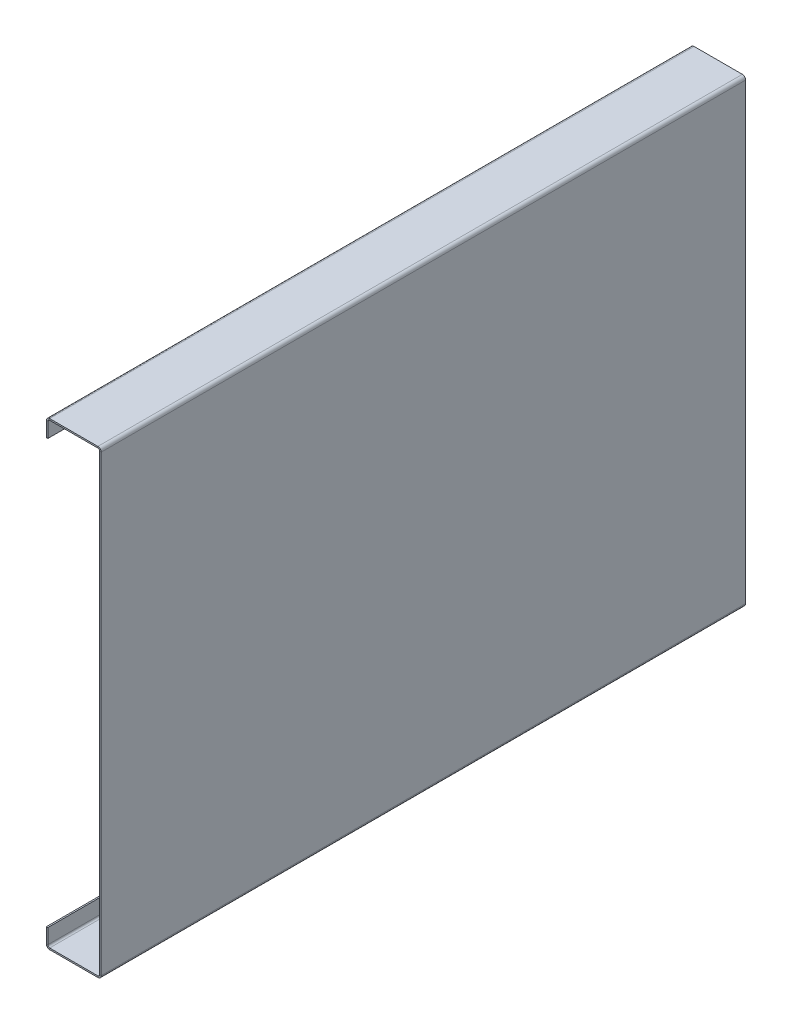
ISO-10303-21;
HEADER;
FILE_DESCRIPTION(('STEP AP214'),'2;1');
FILE_NAME('part.step','',(''),(''),'','','');
FILE_SCHEMA(('AUTOMOTIVE_DESIGN { 1 0 10303 214 1 1 1 1 }'));
ENDSEC;
DATA;
#1=APPLICATION_CONTEXT('core data for automotive mechanical design processes');
#2=APPLICATION_PROTOCOL_DEFINITION('international standard','automotive_design',2000,#1);
#3=PRODUCT_CONTEXT('',#1,'mechanical');
#4=PRODUCT('Part','Part','',(#3));
#5=PRODUCT_RELATED_PRODUCT_CATEGORY('part','',(#4));
#6=PRODUCT_DEFINITION_FORMATION('','',#4);
#7=PRODUCT_DEFINITION_CONTEXT('part definition',#1,'design');
#8=PRODUCT_DEFINITION('design','',#6,#7);
#9=PRODUCT_DEFINITION_SHAPE('','',#8);
#10=(LENGTH_UNIT() NAMED_UNIT(*) SI_UNIT(.MILLI.,.METRE.));
#11=(NAMED_UNIT(*) PLANE_ANGLE_UNIT() SI_UNIT($,.RADIAN.));
#12=(NAMED_UNIT(*) SI_UNIT($,.STERADIAN.) SOLID_ANGLE_UNIT());
#13=UNCERTAINTY_MEASURE_WITH_UNIT(LENGTH_MEASURE(1.E-05),#10,'distance_accuracy_value','');
#14=(GEOMETRIC_REPRESENTATION_CONTEXT(3) GLOBAL_UNCERTAINTY_ASSIGNED_CONTEXT((#13)) GLOBAL_UNIT_ASSIGNED_CONTEXT((#10,
#11,#12)) REPRESENTATION_CONTEXT('',''));
#15=CARTESIAN_POINT('',(0.,0.,0.));
#16=DIRECTION('',(0.,0.,1.));
#17=DIRECTION('',(1.,0.,0.));
#18=AXIS2_PLACEMENT_3D('',#15,#16,#17);
#19=CARTESIAN_POINT('',(-123.499557428757,124.900442571244,0.));
#20=DIRECTION('',(1.,0.,0.));
#21=DIRECTION('',(0.,0.,-1.));
#22=AXIS2_PLACEMENT_3D('',#19,#20,#21);
#23=PLANE('',#22);
#24=DIRECTION('',(0.,-1.,0.));
#25=VECTOR('',#24,1.);
#26=CARTESIAN_POINT('',(-123.499557428757,286.700442571244,-175.));
#27=LINE('',#26,#25);
#28=CARTESIAN_POINT('',(-123.499557428757,248.000885142487,-175.));
#29=VERTEX_POINT('',#28);
#30=CARTESIAN_POINT('',(-123.499557428757,1.79999999999995,-175.));
#31=VERTEX_POINT('',#30);
#32=EDGE_CURVE('E377',#29,#31,#27,.T.);
#33=ORIENTED_EDGE('',*,*,#32,.F.);
#34=DIRECTION('',(0.,0.,1.));
#35=VECTOR('',#34,1.);
#36=CARTESIAN_POINT('',(-123.499557428757,248.000885142487,0.));
#37=LINE('',#36,#35);
#38=CARTESIAN_POINT('',(-123.499557428757,248.000885142487,175.));
#39=VERTEX_POINT('',#38);
#40=EDGE_CURVE('E370',#29,#39,#37,.T.);
#41=ORIENTED_EDGE('',*,*,#40,.T.);
#42=DIRECTION('',(0.,1.,0.));
#43=VECTOR('',#42,1.);
#44=CARTESIAN_POINT('',(-123.499557428757,286.700442571244,175.));
#45=LINE('',#44,#43);
#46=CARTESIAN_POINT('',(-123.499557428756,1.79999999999987,175.));
#47=VERTEX_POINT('',#46);
#48=EDGE_CURVE('E276',#47,#39,#45,.T.);
#49=ORIENTED_EDGE('',*,*,#48,.F.);
#50=DIRECTION('',(0.,0.,1.));
#51=VECTOR('',#50,1.);
#52=CARTESIAN_POINT('',(-123.499557428756,1.79999999999989,0.));
#53=LINE('',#52,#51);
#54=EDGE_CURVE('E359',#31,#47,#53,.T.);
#55=ORIENTED_EDGE('',*,*,#54,.F.);
#56=EDGE_LOOP('',(#33,#41,#49,#55));
#57=FACE_BOUND('',#56,.T.);
#58=ADVANCED_FACE('F56',(#57),#23,.T.);
#59=CARTESIAN_POINT('',(-124.299557428757,286.700442571244,175.));
#60=DIRECTION('',(0.,0.,-1.));
#61=DIRECTION('',(0.,-1.,0.));
#62=AXIS2_PLACEMENT_3D('',#59,#60,#61);
#63=PLANE('',#62);
#64=DIRECTION('',(1.,0.,0.));
#65=VECTOR('',#64,1.);
#66=CARTESIAN_POINT('',(-124.299557428757,248.000885142487,175.));
#67=LINE('',#66,#65);
#68=CARTESIAN_POINT('',(-124.299557428757,248.000885142487,175.));
#69=VERTEX_POINT('',#68);
#70=EDGE_CURVE('E367',#69,#39,#67,.T.);
#71=ORIENTED_EDGE('',*,*,#70,.F.);
#72=DIRECTION('',(0.,1.,0.));
#73=VECTOR('',#72,1.);
#74=CARTESIAN_POINT('',(-124.299557428757,286.700442571244,175.));
#75=LINE('',#74,#73);
#76=CARTESIAN_POINT('',(-124.299557428757,1.8,175.));
#77=VERTEX_POINT('',#76);
#78=EDGE_CURVE('E380',#77,#69,#75,.T.);
#79=ORIENTED_EDGE('',*,*,#78,.F.);
#80=DIRECTION('',(1.,0.,0.));
#81=VECTOR('',#80,1.);
#82=CARTESIAN_POINT('',(-124.299557428756,1.79999999999993,175.));
#83=LINE('',#82,#81);
#84=EDGE_CURVE('E361',#77,#47,#83,.T.);
#85=ORIENTED_EDGE('',*,*,#84,.T.);
#86=ORIENTED_EDGE('',*,*,#48,.T.);
#87=EDGE_LOOP('',(#71,#79,#85,#86));
#88=FACE_BOUND('',#87,.T.);
#89=ADVANCED_FACE('F443',(#88),#63,.F.);
#90=CARTESIAN_POINT('',(-124.299557428757,286.700442571244,-175.));
#91=DIRECTION('',(0.,0.,1.));
#92=DIRECTION('',(0.,1.,0.));
#93=AXIS2_PLACEMENT_3D('',#90,#91,#92);
#94=PLANE('',#93);
#95=DIRECTION('',(-1.,0.,0.));
#96=VECTOR('',#95,1.);
#97=CARTESIAN_POINT('',(-124.299557428757,248.000885142487,-175.));
#98=LINE('',#97,#96);
#99=CARTESIAN_POINT('',(-124.299557428757,248.000885142487,-175.));
#100=VERTEX_POINT('',#99);
#101=EDGE_CURVE('E373',#29,#100,#98,.T.);
#102=ORIENTED_EDGE('',*,*,#101,.F.);
#103=ORIENTED_EDGE('',*,*,#32,.T.);
#104=DIRECTION('',(-1.,0.,0.));
#105=VECTOR('',#104,1.);
#106=CARTESIAN_POINT('',(-124.299557428756,1.7999999999999,-175.));
#107=LINE('',#106,#105);
#108=CARTESIAN_POINT('',(-124.299557428757,1.8,-175.));
#109=VERTEX_POINT('',#108);
#110=EDGE_CURVE('E355',#31,#109,#107,.T.);
#111=ORIENTED_EDGE('',*,*,#110,.T.);
#112=DIRECTION('',(0.,-1.,0.));
#113=VECTOR('',#112,1.);
#114=CARTESIAN_POINT('',(-124.299557428757,286.700442571244,-175.));
#115=LINE('',#114,#113);
#116=EDGE_CURVE('E356',#100,#109,#115,.T.);
#117=ORIENTED_EDGE('',*,*,#116,.F.);
#118=EDGE_LOOP('',(#102,#103,#111,#117));
#119=FACE_BOUND('',#118,.T.);
#120=ADVANCED_FACE('F455',(#119),#94,.F.);
#121=CARTESIAN_POINT('',(-124.299557428757,124.900442571244,0.));
#122=DIRECTION('',(1.,0.,0.));
#123=DIRECTION('',(0.,0.,-1.));
#124=AXIS2_PLACEMENT_3D('',#121,#122,#123);
#125=PLANE('',#124);
#126=DIRECTION('',(0.,0.,1.));
#127=VECTOR('',#126,1.);
#128=CARTESIAN_POINT('',(-124.299557428757,248.000885142487,0.));
#129=LINE('',#128,#127);
#130=EDGE_CURVE('E364',#100,#69,#129,.T.);
#131=ORIENTED_EDGE('',*,*,#130,.F.);
#132=ORIENTED_EDGE('',*,*,#116,.T.);
#133=DIRECTION('',(0.,0.,1.));
#134=VECTOR('',#133,1.);
#135=CARTESIAN_POINT('',(-124.299557428756,1.79999999999989,0.));
#136=LINE('',#135,#134);
#137=EDGE_CURVE('E352',#109,#77,#136,.T.);
#138=ORIENTED_EDGE('',*,*,#137,.T.);
#139=ORIENTED_EDGE('',*,*,#78,.T.);
#140=EDGE_LOOP('',(#131,#132,#138,#139));
#141=FACE_BOUND('',#140,.T.);
#142=ADVANCED_FACE('F450',(#141),#125,.F.);
#143=CARTESIAN_POINT('',(-152.500442571244,9.90044257124353,-175.));
#144=DIRECTION('',(0.,-1.,0.));
#145=DIRECTION('',(0.,0.,-1.));
#146=AXIS2_PLACEMENT_3D('',#143,#144,#145);
#147=PLANE('',#146);
#148=DIRECTION('',(0.,0.,1.));
#149=VECTOR('',#148,1.);
#150=CARTESIAN_POINT('',(-153.300442571244,9.90044257124353,-175.));
#151=LINE('',#150,#149);
#152=CARTESIAN_POINT('',(-153.300442571244,9.90044257124353,-175.));
#153=VERTEX_POINT('',#152);
#154=CARTESIAN_POINT('',(-153.300442571244,9.90044257124353,175.));
#155=VERTEX_POINT('',#154);
#156=EDGE_CURVE('E341',#153,#155,#151,.T.);
#157=ORIENTED_EDGE('',*,*,#156,.T.);
#158=DIRECTION('',(-1.,0.,0.));
#159=VECTOR('',#158,1.);
#160=CARTESIAN_POINT('',(-152.500442571244,9.90044257124353,175.));
#161=LINE('',#160,#159);
#162=CARTESIAN_POINT('',(-152.500442571244,9.90044257124353,175.));
#163=VERTEX_POINT('',#162);
#164=EDGE_CURVE('E335',#163,#155,#161,.T.);
#165=ORIENTED_EDGE('',*,*,#164,.F.);
#166=DIRECTION('',(0.,0.,1.));
#167=VECTOR('',#166,1.);
#168=CARTESIAN_POINT('',(-152.500442571244,9.90044257124353,-175.));
#169=LINE('',#168,#167);
#170=CARTESIAN_POINT('',(-152.500442571244,9.90044257124353,-175.));
#171=VERTEX_POINT('',#170);
#172=EDGE_CURVE('E323',#171,#163,#169,.T.);
#173=ORIENTED_EDGE('',*,*,#172,.F.);
#174=DIRECTION('',(-1.,0.,0.));
#175=VECTOR('',#174,1.);
#176=CARTESIAN_POINT('',(-152.500442571244,9.90044257124353,-175.));
#177=LINE('',#176,#175);
#178=EDGE_CURVE('E338',#171,#153,#177,.T.);
#179=ORIENTED_EDGE('',*,*,#178,.T.);
#180=EDGE_LOOP('',(#157,#165,#173,#179));
#181=FACE_BOUND('',#180,.T.);
#182=ADVANCED_FACE('F513',(#181),#147,.F.);
#183=CARTESIAN_POINT('',(-152.500442571245,-313.699557428756,175.));
#184=DIRECTION('',(0.,0.,-1.));
#185=DIRECTION('',(0.,1.,0.));
#186=AXIS2_PLACEMENT_3D('',#183,#184,#185);
#187=PLANE('',#186);
#188=DIRECTION('',(-1.,0.,0.));
#189=VECTOR('',#188,1.);
#190=CARTESIAN_POINT('',(-152.500442571244,1.79999999999994,175.));
#191=LINE('',#190,#189);
#192=CARTESIAN_POINT('',(-152.500442571244,1.79999999999999,175.));
#193=VERTEX_POINT('',#192);
#194=CARTESIAN_POINT('',(-153.300442571244,1.79999999999994,175.));
#195=VERTEX_POINT('',#194);
#196=EDGE_CURVE('E317',#193,#195,#191,.T.);
#197=ORIENTED_EDGE('',*,*,#196,.F.);
#198=DIRECTION('',(0.,-1.,0.));
#199=VECTOR('',#198,1.);
#200=CARTESIAN_POINT('',(-152.500442571245,-313.699557428756,175.));
#201=LINE('',#200,#199);
#202=EDGE_CURVE('E320',#163,#193,#201,.T.);
#203=ORIENTED_EDGE('',*,*,#202,.F.);
#204=ORIENTED_EDGE('',*,*,#164,.T.);
#205=DIRECTION('',(0.,-1.,0.));
#206=VECTOR('',#205,1.);
#207=CARTESIAN_POINT('',(-153.300442571245,-313.699557428756,175.));
#208=LINE('',#207,#206);
#209=EDGE_CURVE('E333',#155,#195,#208,.T.);
#210=ORIENTED_EDGE('',*,*,#209,.T.);
#211=EDGE_LOOP('',(#197,#203,#204,#210));
#212=FACE_BOUND('',#211,.T.);
#213=ADVANCED_FACE('F494',(#212),#187,.F.);
#214=CARTESIAN_POINT('',(-153.300442571244,-151.899557428756,0.));
#215=DIRECTION('',(-1.,0.,0.));
#216=DIRECTION('',(0.,0.,-1.));
#217=AXIS2_PLACEMENT_3D('',#214,#215,#216);
#218=PLANE('',#217);
#219=DIRECTION('',(0.,1.,0.));
#220=VECTOR('',#219,1.);
#221=CARTESIAN_POINT('',(-153.300442571245,-313.699557428757,-175.));
#222=LINE('',#221,#220);
#223=CARTESIAN_POINT('',(-153.300442571244,1.79999999999983,-175.));
#224=VERTEX_POINT('',#223);
#225=EDGE_CURVE('E328',#224,#153,#222,.T.);
#226=ORIENTED_EDGE('',*,*,#225,.F.);
#227=DIRECTION('',(0.,0.,1.));
#228=VECTOR('',#227,1.);
#229=CARTESIAN_POINT('',(-153.300442571244,1.79999999999997,0.));
#230=LINE('',#229,#228);
#231=EDGE_CURVE('E330',#224,#195,#230,.T.);
#232=ORIENTED_EDGE('',*,*,#231,.T.);
#233=ORIENTED_EDGE('',*,*,#209,.F.);
#234=ORIENTED_EDGE('',*,*,#156,.F.);
#235=EDGE_LOOP('',(#226,#232,#233,#234));
#236=FACE_BOUND('',#235,.T.);
#237=ADVANCED_FACE('F510',(#236),#218,.T.);
#238=CARTESIAN_POINT('',(-152.500442571245,-313.699557428757,-175.));
#239=DIRECTION('',(0.,0.,1.));
#240=DIRECTION('',(0.,-1.,0.));
#241=AXIS2_PLACEMENT_3D('',#238,#239,#240);
#242=PLANE('',#241);
#243=DIRECTION('',(1.,0.,0.));
#244=VECTOR('',#243,1.);
#245=CARTESIAN_POINT('',(-152.500442571244,1.79999999999994,-175.));
#246=LINE('',#245,#244);
#247=CARTESIAN_POINT('',(-152.500442571244,1.79999999999983,-175.));
#248=VERTEX_POINT('',#247);
#249=EDGE_CURVE('E306',#224,#248,#246,.T.);
#250=ORIENTED_EDGE('',*,*,#249,.F.);
#251=ORIENTED_EDGE('',*,*,#225,.T.);
#252=ORIENTED_EDGE('',*,*,#178,.F.);
#253=DIRECTION('',(0.,1.,0.));
#254=VECTOR('',#253,1.);
#255=CARTESIAN_POINT('',(-152.500442571245,-313.699557428757,-175.));
#256=LINE('',#255,#254);
#257=EDGE_CURVE('E326',#248,#171,#256,.T.);
#258=ORIENTED_EDGE('',*,*,#257,.F.);
#259=EDGE_LOOP('',(#250,#251,#252,#258));
#260=FACE_BOUND('',#259,.T.);
#261=ADVANCED_FACE('F507',(#260),#242,.F.);
#262=CARTESIAN_POINT('',(-152.500442571244,-151.899557428756,0.));
#263=DIRECTION('',(-1.,0.,0.));
#264=DIRECTION('',(0.,0.,-1.));
#265=AXIS2_PLACEMENT_3D('',#262,#263,#264);
#266=PLANE('',#265);
#267=DIRECTION('',(0.,0.,1.));
#268=VECTOR('',#267,1.);
#269=CARTESIAN_POINT('',(-152.500442571244,1.79999999999997,0.));
#270=LINE('',#269,#268);
#271=EDGE_CURVE('E297',#248,#193,#270,.T.);
#272=ORIENTED_EDGE('',*,*,#271,.F.);
#273=ORIENTED_EDGE('',*,*,#257,.T.);
#274=ORIENTED_EDGE('',*,*,#172,.T.);
#275=ORIENTED_EDGE('',*,*,#202,.T.);
#276=EDGE_LOOP('',(#272,#273,#274,#275));
#277=FACE_BOUND('',#276,.T.);
#278=ADVANCED_FACE('F496',(#277),#266,.F.);
#279=CARTESIAN_POINT('',(-151.500442571244,1.8,175.));
#280=DIRECTION('',(0.,0.,-1.));
#281=DIRECTION('',(-1.,0.,0.));
#282=AXIS2_PLACEMENT_3D('',#279,#280,#281);
#283=PLANE('',#282);
#284=ORIENTED_EDGE('',*,*,#196,.T.);
#285=CARTESIAN_POINT('',(-151.500442571244,1.8,175.));
#286=DIRECTION('',(0.,0.,1.));
#287=DIRECTION('',(1.,0.,0.));
#288=AXIS2_PLACEMENT_3D('',#285,#286,#287);
#289=CIRCLE('',#288,1.8);
#290=CARTESIAN_POINT('',(-151.500442571244,0.,175.));
#291=VERTEX_POINT('',#290);
#292=EDGE_CURVE('E314',#195,#291,#289,.T.);
#293=ORIENTED_EDGE('',*,*,#292,.T.);
#294=DIRECTION('',(0.,-1.,0.));
#295=VECTOR('',#294,1.);
#296=CARTESIAN_POINT('',(-151.500442571244,0.8,175.));
#297=LINE('',#296,#295);
#298=CARTESIAN_POINT('',(-151.500442571244,0.799999999999999,175.));
#299=VERTEX_POINT('',#298);
#300=EDGE_CURVE('E277',#299,#291,#297,.T.);
#301=ORIENTED_EDGE('',*,*,#300,.F.);
#302=CARTESIAN_POINT('',(-151.500442571244,1.8,175.));
#303=DIRECTION('',(0.,0.,1.));
#304=DIRECTION('',(1.,0.,0.));
#305=AXIS2_PLACEMENT_3D('',#302,#303,#304);
#306=CIRCLE('',#305,1.);
#307=EDGE_CURVE('E303',#193,#299,#306,.T.);
#308=ORIENTED_EDGE('',*,*,#307,.F.);
#309=EDGE_LOOP('',(#284,#293,#301,#308));
#310=FACE_BOUND('',#309,.T.);
#311=ADVANCED_FACE('F491',(#310),#283,.F.);
#312=CARTESIAN_POINT('',(-151.500442571244,1.8,-350.007822921369));
#313=DIRECTION('',(0.,0.,1.));
#314=DIRECTION('',(1.,0.,0.));
#315=AXIS2_PLACEMENT_3D('',#312,#313,#314);
#316=CYLINDRICAL_SURFACE('',#315,1.8);
#317=ORIENTED_EDGE('',*,*,#292,.F.);
#318=ORIENTED_EDGE('',*,*,#231,.F.);
#319=CARTESIAN_POINT('',(-151.500442571244,1.8,-175.));
#320=DIRECTION('',(0.,0.,1.));
#321=DIRECTION('',(1.,0.,0.));
#322=AXIS2_PLACEMENT_3D('',#319,#320,#321);
#323=CIRCLE('',#322,1.8);
#324=CARTESIAN_POINT('',(-151.500442571244,0.,-175.));
#325=VERTEX_POINT('',#324);
#326=EDGE_CURVE('E309',#325,#224,#323,.F.);
#327=ORIENTED_EDGE('',*,*,#326,.F.);
#328=DIRECTION('',(0.,0.,1.));
#329=VECTOR('',#328,1.);
#330=CARTESIAN_POINT('',(-151.500442571244,0.,0.));
#331=LINE('',#330,#329);
#332=EDGE_CURVE('E312',#325,#291,#331,.T.);
#333=ORIENTED_EDGE('',*,*,#332,.T.);
#334=EDGE_LOOP('',(#317,#318,#327,#333));
#335=FACE_BOUND('',#334,.T.);
#336=ADVANCED_FACE('F488',(#335),#316,.T.);
#337=CARTESIAN_POINT('',(-151.500442571244,1.8,-175.));
#338=DIRECTION('',(0.,0.,1.));
#339=DIRECTION('',(1.,0.,0.));
#340=AXIS2_PLACEMENT_3D('',#337,#338,#339);
#341=PLANE('',#340);
#342=DIRECTION('',(0.,1.,0.));
#343=VECTOR('',#342,1.);
#344=CARTESIAN_POINT('',(-151.500442571244,0.8,-175.));
#345=LINE('',#344,#343);
#346=CARTESIAN_POINT('',(-151.500442571244,0.799999999999999,-175.));
#347=VERTEX_POINT('',#346);
#348=EDGE_CURVE('E283',#325,#347,#345,.T.);
#349=ORIENTED_EDGE('',*,*,#348,.F.);
#350=ORIENTED_EDGE('',*,*,#326,.T.);
#351=ORIENTED_EDGE('',*,*,#249,.T.);
#352=CARTESIAN_POINT('',(-151.500442571244,1.8,-175.));
#353=DIRECTION('',(0.,0.,-1.));
#354=DIRECTION('',(-1.,0.,0.));
#355=AXIS2_PLACEMENT_3D('',#352,#353,#354);
#356=CIRCLE('',#355,1.);
#357=EDGE_CURVE('E300',#347,#248,#356,.T.);
#358=ORIENTED_EDGE('',*,*,#357,.F.);
#359=EDGE_LOOP('',(#349,#350,#351,#358));
#360=FACE_BOUND('',#359,.T.);
#361=ADVANCED_FACE('F504',(#360),#341,.F.);
#362=CARTESIAN_POINT('',(-151.500442571244,1.8,-350.007822921369));
#363=DIRECTION('',(0.,0.,1.));
#364=DIRECTION('',(1.,0.,0.));
#365=AXIS2_PLACEMENT_3D('',#362,#363,#364);
#366=CYLINDRICAL_SURFACE('',#365,1.);
#367=ORIENTED_EDGE('',*,*,#307,.T.);
#368=DIRECTION('',(0.,0.,1.));
#369=VECTOR('',#368,1.);
#370=CARTESIAN_POINT('',(-151.500442571244,0.8,0.));
#371=LINE('',#370,#369);
#372=EDGE_CURVE('E291',#347,#299,#371,.T.);
#373=ORIENTED_EDGE('',*,*,#372,.F.);
#374=ORIENTED_EDGE('',*,*,#357,.T.);
#375=ORIENTED_EDGE('',*,*,#271,.T.);
#376=EDGE_LOOP('',(#367,#373,#374,#375));
#377=FACE_BOUND('',#376,.T.);
#378=ADVANCED_FACE('F501',(#377),#366,.F.);
#379=CARTESIAN_POINT('',(0.,0.8,0.));
#380=DIRECTION('',(0.,-1.,0.));
#381=DIRECTION('',(0.,0.,-1.));
#382=AXIS2_PLACEMENT_3D('',#379,#380,#381);
#383=PLANE('',#382);
#384=DIRECTION('',(0.,0.,1.));
#385=VECTOR('',#384,1.);
#386=CARTESIAN_POINT('',(-125.299557428757,0.8,0.));
#387=LINE('',#386,#385);
#388=CARTESIAN_POINT('',(-125.299557428756,0.799999999999999,-175.));
#389=VERTEX_POINT('',#388);
#390=CARTESIAN_POINT('',(-125.299557428756,0.8,175.));
#391=VERTEX_POINT('',#390);
#392=EDGE_CURVE('E269',#389,#391,#387,.T.);
#393=ORIENTED_EDGE('',*,*,#392,.F.);
#394=DIRECTION('',(-1.,0.,0.));
#395=VECTOR('',#394,1.);
#396=CARTESIAN_POINT('',(161.8,0.8,-175.));
#397=LINE('',#396,#395);
#398=EDGE_CURVE('E294',#389,#347,#397,.T.);
#399=ORIENTED_EDGE('',*,*,#398,.T.);
#400=ORIENTED_EDGE('',*,*,#372,.T.);
#401=DIRECTION('',(1.,0.,0.));
#402=VECTOR('',#401,1.);
#403=CARTESIAN_POINT('',(161.8,0.8,175.));
#404=LINE('',#403,#402);
#405=EDGE_CURVE('E289',#299,#391,#404,.T.);
#406=ORIENTED_EDGE('',*,*,#405,.T.);
#407=EDGE_LOOP('',(#393,#399,#400,#406));
#408=FACE_BOUND('',#407,.T.);
#409=ADVANCED_FACE('F476',(#408),#383,.F.);
#410=CARTESIAN_POINT('',(161.8,0.8,-175.));
#411=DIRECTION('',(0.,0.,1.));
#412=DIRECTION('',(1.,0.,0.));
#413=AXIS2_PLACEMENT_3D('',#410,#411,#412);
#414=PLANE('',#413);
#415=DIRECTION('',(0.,1.,0.));
#416=VECTOR('',#415,1.);
#417=CARTESIAN_POINT('',(-125.299557428756,0.8,-175.));
#418=LINE('',#417,#416);
#419=CARTESIAN_POINT('',(-125.299557428756,0.,-175.));
#420=VERTEX_POINT('',#419);
#421=EDGE_CURVE('E344',#420,#389,#418,.T.);
#422=ORIENTED_EDGE('',*,*,#421,.F.);
#423=DIRECTION('',(-1.,0.,0.));
#424=VECTOR('',#423,1.);
#425=CARTESIAN_POINT('',(161.8,0.,-175.));
#426=LINE('',#425,#424);
#427=EDGE_CURVE('E286',#420,#325,#426,.T.);
#428=ORIENTED_EDGE('',*,*,#427,.T.);
#429=ORIENTED_EDGE('',*,*,#348,.T.);
#430=ORIENTED_EDGE('',*,*,#398,.F.);
#431=EDGE_LOOP('',(#422,#428,#429,#430));
#432=FACE_BOUND('',#431,.T.);
#433=ADVANCED_FACE('F481',(#432),#414,.F.);
#434=CARTESIAN_POINT('',(0.,0.,0.));
#435=DIRECTION('',(0.,-1.,0.));
#436=DIRECTION('',(0.,0.,-1.));
#437=AXIS2_PLACEMENT_3D('',#434,#435,#436);
#438=PLANE('',#437);
#439=ORIENTED_EDGE('',*,*,#427,.F.);
#440=DIRECTION('',(0.,0.,1.));
#441=VECTOR('',#440,1.);
#442=CARTESIAN_POINT('',(-125.299557428757,0.,0.));
#443=LINE('',#442,#441);
#444=CARTESIAN_POINT('',(-125.299557428756,0.,175.));
#445=VERTEX_POINT('',#444);
#446=EDGE_CURVE('E280',#420,#445,#443,.T.);
#447=ORIENTED_EDGE('',*,*,#446,.T.);
#448=DIRECTION('',(1.,0.,0.));
#449=VECTOR('',#448,1.);
#450=CARTESIAN_POINT('',(161.8,0.,175.));
#451=LINE('',#450,#449);
#452=EDGE_CURVE('E274',#291,#445,#451,.T.);
#453=ORIENTED_EDGE('',*,*,#452,.F.);
#454=ORIENTED_EDGE('',*,*,#332,.F.);
#455=EDGE_LOOP('',(#439,#447,#453,#454));
#456=FACE_BOUND('',#455,.T.);
#457=ADVANCED_FACE('F484',(#456),#438,.T.);
#458=CARTESIAN_POINT('',(161.8,0.8,175.));
#459=DIRECTION('',(0.,0.,-1.));
#460=DIRECTION('',(-1.,0.,0.));
#461=AXIS2_PLACEMENT_3D('',#458,#459,#460);
#462=PLANE('',#461);
#463=DIRECTION('',(0.,-1.,0.));
#464=VECTOR('',#463,1.);
#465=CARTESIAN_POINT('',(-125.299557428756,0.8,175.));
#466=LINE('',#465,#464);
#467=EDGE_CURVE('E347',#391,#445,#466,.T.);
#468=ORIENTED_EDGE('',*,*,#467,.F.);
#469=ORIENTED_EDGE('',*,*,#405,.F.);
#470=ORIENTED_EDGE('',*,*,#300,.T.);
#471=ORIENTED_EDGE('',*,*,#452,.T.);
#472=EDGE_LOOP('',(#468,#469,#470,#471));
#473=FACE_BOUND('',#472,.T.);
#474=ADVANCED_FACE('F469',(#473),#462,.F.);
#475=CARTESIAN_POINT('',(-125.299557428757,1.8,-175.));
#476=DIRECTION('',(0.,0.,1.));
#477=DIRECTION('',(1.,0.,0.));
#478=AXIS2_PLACEMENT_3D('',#475,#476,#477);
#479=PLANE('',#478);
#480=ORIENTED_EDGE('',*,*,#110,.F.);
#481=CARTESIAN_POINT('',(-125.299557428757,1.8,-175.));
#482=DIRECTION('',(0.,0.,-1.));
#483=DIRECTION('',(-1.,0.,0.));
#484=AXIS2_PLACEMENT_3D('',#481,#482,#483);
#485=CIRCLE('',#484,1.8);
#486=EDGE_CURVE('E257',#31,#420,#485,.T.);
#487=ORIENTED_EDGE('',*,*,#486,.T.);
#488=ORIENTED_EDGE('',*,*,#421,.T.);
#489=CARTESIAN_POINT('',(-125.299557428757,1.8,-175.));
#490=DIRECTION('',(0.,0.,-1.));
#491=DIRECTION('',(-1.,0.,0.));
#492=AXIS2_PLACEMENT_3D('',#489,#490,#491);
#493=CIRCLE('',#492,1.);
#494=EDGE_CURVE('E262',#109,#389,#493,.T.);
#495=ORIENTED_EDGE('',*,*,#494,.F.);
#496=EDGE_LOOP('',(#480,#487,#488,#495));
#497=FACE_BOUND('',#496,.T.);
#498=ADVANCED_FACE('F479',(#497),#479,.F.);
#499=CARTESIAN_POINT('',(-125.299557428756,1.8,175.));
#500=DIRECTION('',(0.,0.,-1.));
#501=DIRECTION('',(-1.,0.,0.));
#502=AXIS2_PLACEMENT_3D('',#499,#500,#501);
#503=PLANE('',#502);
#504=ORIENTED_EDGE('',*,*,#467,.T.);
#505=CARTESIAN_POINT('',(-125.299557428757,1.8,175.));
#506=DIRECTION('',(0.,0.,-1.));
#507=DIRECTION('',(-1.,0.,0.));
#508=AXIS2_PLACEMENT_3D('',#505,#506,#507);
#509=CIRCLE('',#508,1.8);
#510=EDGE_CURVE('E266',#445,#47,#509,.F.);
#511=ORIENTED_EDGE('',*,*,#510,.T.);
#512=ORIENTED_EDGE('',*,*,#84,.F.);
#513=CARTESIAN_POINT('',(-125.299557428756,1.8,175.));
#514=DIRECTION('',(0.,0.,1.));
#515=DIRECTION('',(1.,0.,0.));
#516=AXIS2_PLACEMENT_3D('',#513,#514,#515);
#517=CIRCLE('',#516,0.999999999999987);
#518=EDGE_CURVE('E265',#391,#77,#517,.T.);
#519=ORIENTED_EDGE('',*,*,#518,.F.);
#520=EDGE_LOOP('',(#504,#511,#512,#519));
#521=FACE_BOUND('',#520,.T.);
#522=ADVANCED_FACE('F464',(#521),#503,.F.);
#523=CARTESIAN_POINT('',(-125.299557428756,1.8,350.007822921369));
#524=DIRECTION('',(0.,0.,-1.));
#525=DIRECTION('',(-1.,0.,0.));
#526=AXIS2_PLACEMENT_3D('',#523,#524,#525);
#527=CYLINDRICAL_SURFACE('',#526,1.);
#528=ORIENTED_EDGE('',*,*,#518,.T.);
#529=ORIENTED_EDGE('',*,*,#137,.F.);
#530=ORIENTED_EDGE('',*,*,#494,.T.);
#531=ORIENTED_EDGE('',*,*,#392,.T.);
#532=EDGE_LOOP('',(#528,#529,#530,#531));
#533=FACE_BOUND('',#532,.T.);
#534=ADVANCED_FACE('F473',(#533),#527,.F.);
#535=CARTESIAN_POINT('',(-125.299557428756,1.8,350.007822921369));
#536=DIRECTION('',(0.,0.,-1.));
#537=DIRECTION('',(-1.,0.,0.));
#538=AXIS2_PLACEMENT_3D('',#535,#536,#537);
#539=CYLINDRICAL_SURFACE('',#538,1.8);
#540=ORIENTED_EDGE('',*,*,#510,.F.);
#541=ORIENTED_EDGE('',*,*,#446,.F.);
#542=ORIENTED_EDGE('',*,*,#486,.F.);
#543=ORIENTED_EDGE('',*,*,#54,.T.);
#544=EDGE_LOOP('',(#540,#541,#542,#543));
#545=FACE_BOUND('',#544,.T.);
#546=ADVANCED_FACE('F461',(#545),#539,.T.);
#547=CARTESIAN_POINT('',(-125.299557428757,248.000885142487,175.));
#548=DIRECTION('',(0.,0.,-1.));
#549=DIRECTION('',(-1.,0.,0.));
#550=AXIS2_PLACEMENT_3D('',#547,#548,#549);
#551=PLANE('',#550);
#552=ORIENTED_EDGE('',*,*,#70,.T.);
#553=CARTESIAN_POINT('',(-125.299557428757,248.000885142487,175.));
#554=DIRECTION('',(0.,0.,-1.));
#555=DIRECTION('',(0.,1.,0.));
#556=AXIS2_PLACEMENT_3D('',#553,#554,#555);
#557=CIRCLE('',#556,1.8);
#558=CARTESIAN_POINT('',(-125.299557428757,249.800885142487,175.));
#559=VERTEX_POINT('',#558);
#560=EDGE_CURVE('E241',#39,#559,#557,.F.);
#561=ORIENTED_EDGE('',*,*,#560,.T.);
#562=DIRECTION('',(0.,1.,0.));
#563=VECTOR('',#562,1.);
#564=CARTESIAN_POINT('',(-125.299557428757,249.000885142487,175.));
#565=LINE('',#564,#563);
#566=CARTESIAN_POINT('',(-125.299557428757,249.000885142487,175.));
#567=VERTEX_POINT('',#566);
#568=EDGE_CURVE('E242',#567,#559,#565,.T.);
#569=ORIENTED_EDGE('',*,*,#568,.F.);
#570=CARTESIAN_POINT('',(-125.299557428757,248.000885142487,175.));
#571=DIRECTION('',(0.,0.,-1.));
#572=DIRECTION('',(0.,1.,0.));
#573=AXIS2_PLACEMENT_3D('',#570,#571,#572);
#574=CIRCLE('',#573,1.);
#575=EDGE_CURVE('E250',#69,#567,#574,.F.);
#576=ORIENTED_EDGE('',*,*,#575,.F.);
#577=EDGE_LOOP('',(#552,#561,#569,#576));
#578=FACE_BOUND('',#577,.T.);
#579=ADVANCED_FACE('F439',(#578),#551,.F.);
#580=CARTESIAN_POINT('',(-125.299557428757,248.000885142487,-175.));
#581=DIRECTION('',(0.,0.,1.));
#582=DIRECTION('',(1.,0.,0.));
#583=AXIS2_PLACEMENT_3D('',#580,#581,#582);
#584=PLANE('',#583);
#585=CARTESIAN_POINT('',(-125.299557428757,248.000885142487,-175.));
#586=DIRECTION('',(0.,0.,-1.));
#587=DIRECTION('',(0.,1.,0.));
#588=AXIS2_PLACEMENT_3D('',#585,#586,#587);
#589=CIRCLE('',#588,1.8);
#590=CARTESIAN_POINT('',(-125.299557428757,249.800885142487,-175.));
#591=VERTEX_POINT('',#590);
#592=EDGE_CURVE('E254',#591,#29,#589,.T.);
#593=ORIENTED_EDGE('',*,*,#592,.T.);
#594=ORIENTED_EDGE('',*,*,#101,.T.);
#595=CARTESIAN_POINT('',(-125.299557428757,248.000885142487,-175.));
#596=DIRECTION('',(0.,0.,-1.));
#597=DIRECTION('',(0.,1.,0.));
#598=AXIS2_PLACEMENT_3D('',#595,#596,#597);
#599=CIRCLE('',#598,1.);
#600=CARTESIAN_POINT('',(-125.299557428757,249.000885142487,-175.));
#601=VERTEX_POINT('',#600);
#602=EDGE_CURVE('E253',#601,#100,#599,.T.);
#603=ORIENTED_EDGE('',*,*,#602,.F.);
#604=DIRECTION('',(0.,-1.,0.));
#605=VECTOR('',#604,1.);
#606=CARTESIAN_POINT('',(-125.299557428757,249.000885142487,-175.));
#607=LINE('',#606,#605);
#608=EDGE_CURVE('E238',#591,#601,#607,.T.);
#609=ORIENTED_EDGE('',*,*,#608,.F.);
#610=EDGE_LOOP('',(#593,#594,#603,#609));
#611=FACE_BOUND('',#610,.T.);
#612=ADVANCED_FACE('F453',(#611),#584,.F.);
#613=CARTESIAN_POINT('',(-125.299557428757,248.000885142487,350.007822921369));
#614=DIRECTION('',(0.,0.,-1.));
#615=DIRECTION('',(0.,1.,0.));
#616=AXIS2_PLACEMENT_3D('',#613,#614,#615);
#617=CYLINDRICAL_SURFACE('',#616,1.);
#618=DIRECTION('',(0.,0.,1.));
#619=VECTOR('',#618,1.);
#620=CARTESIAN_POINT('',(-125.299557428757,249.000885142487,0.));
#621=LINE('',#620,#619);
#622=EDGE_CURVE('E245',#601,#567,#621,.T.);
#623=ORIENTED_EDGE('',*,*,#622,.F.);
#624=ORIENTED_EDGE('',*,*,#602,.T.);
#625=ORIENTED_EDGE('',*,*,#130,.T.);
#626=ORIENTED_EDGE('',*,*,#575,.T.);
#627=EDGE_LOOP('',(#623,#624,#625,#626));
#628=FACE_BOUND('',#627,.T.);
#629=ADVANCED_FACE('F447',(#628),#617,.F.);
#630=CARTESIAN_POINT('',(-125.299557428757,248.000885142487,350.007822921369));
#631=DIRECTION('',(0.,0.,-1.));
#632=DIRECTION('',(0.,1.,0.));
#633=AXIS2_PLACEMENT_3D('',#630,#631,#632);
#634=CYLINDRICAL_SURFACE('',#633,1.8);
#635=DIRECTION('',(0.,0.,1.));
#636=VECTOR('',#635,1.);
#637=CARTESIAN_POINT('',(-125.299557428757,249.800885142487,0.));
#638=LINE('',#637,#636);
#639=EDGE_CURVE('E231',#591,#559,#638,.T.);
#640=ORIENTED_EDGE('',*,*,#639,.T.);
#641=ORIENTED_EDGE('',*,*,#560,.F.);
#642=ORIENTED_EDGE('',*,*,#40,.F.);
#643=ORIENTED_EDGE('',*,*,#592,.F.);
#644=EDGE_LOOP('',(#640,#641,#642,#643));
#645=FACE_BOUND('',#644,.T.);
#646=ADVANCED_FACE('F437',(#645),#634,.T.);
#647=CARTESIAN_POINT('',(-7.63278329429795E-13,249.000885142488,0.));
#648=DIRECTION('',(0.,1.,0.));
#649=DIRECTION('',(0.,0.,-1.));
#650=AXIS2_PLACEMENT_3D('',#647,#648,#649);
#651=PLANE('',#650);
#652=DIRECTION('',(0.,0.,1.));
#653=VECTOR('',#652,1.);
#654=CARTESIAN_POINT('',(-151.500442571244,249.000885142487,0.));
#655=LINE('',#654,#653);
#656=CARTESIAN_POINT('',(-151.500442571244,249.000885142487,-175.));
#657=VERTEX_POINT('',#656);
#658=CARTESIAN_POINT('',(-151.500442571244,249.000885142487,175.));
#659=VERTEX_POINT('',#658);
#660=EDGE_CURVE('E376',#657,#659,#655,.T.);
#661=ORIENTED_EDGE('',*,*,#660,.F.);
#662=DIRECTION('',(1.,0.,0.));
#663=VECTOR('',#662,1.);
#664=CARTESIAN_POINT('',(-161.800000000001,249.000885142487,-175.));
#665=LINE('',#664,#663);
#666=EDGE_CURVE('E60',#657,#601,#665,.T.);
#667=ORIENTED_EDGE('',*,*,#666,.T.);
#668=ORIENTED_EDGE('',*,*,#622,.T.);
#669=DIRECTION('',(-1.,0.,0.));
#670=VECTOR('',#669,1.);
#671=CARTESIAN_POINT('',(-161.800000000001,249.000885142487,175.));
#672=LINE('',#671,#670);
#673=EDGE_CURVE('E244',#567,#659,#672,.T.);
#674=ORIENTED_EDGE('',*,*,#673,.T.);
#675=EDGE_LOOP('',(#661,#667,#668,#674));
#676=FACE_BOUND('',#675,.T.);
#677=ADVANCED_FACE('F394',(#676),#651,.F.);
#678=CARTESIAN_POINT('',(-161.800000000001,249.000885142487,175.));
#679=DIRECTION('',(0.,0.,-1.));
#680=DIRECTION('',(1.,0.,0.));
#681=AXIS2_PLACEMENT_3D('',#678,#679,#680);
#682=PLANE('',#681);
#683=DIRECTION('',(0.,1.,0.));
#684=VECTOR('',#683,1.);
#685=CARTESIAN_POINT('',(-151.500442571244,249.000885142487,175.));
#686=LINE('',#685,#684);
#687=CARTESIAN_POINT('',(-151.500442571244,249.800885142487,175.));
#688=VERTEX_POINT('',#687);
#689=EDGE_CURVE('E387',#659,#688,#686,.T.);
#690=ORIENTED_EDGE('',*,*,#689,.F.);
#691=ORIENTED_EDGE('',*,*,#673,.F.);
#692=ORIENTED_EDGE('',*,*,#568,.T.);
#693=DIRECTION('',(-1.,0.,0.));
#694=VECTOR('',#693,1.);
#695=CARTESIAN_POINT('',(-161.800000000001,249.800885142487,175.));
#696=LINE('',#695,#694);
#697=EDGE_CURVE('E81',#559,#688,#696,.T.);
#698=ORIENTED_EDGE('',*,*,#697,.T.);
#699=EDGE_LOOP('',(#690,#691,#692,#698));
#700=FACE_BOUND('',#699,.T.);
#701=ADVANCED_FACE('F397',(#700),#682,.F.);
#702=CARTESIAN_POINT('',(-7.63278329429795E-13,249.800885142488,0.));
#703=DIRECTION('',(0.,1.,0.));
#704=DIRECTION('',(0.,0.,-1.));
#705=AXIS2_PLACEMENT_3D('',#702,#703,#704);
#706=PLANE('',#705);
#707=DIRECTION('',(1.,0.,0.));
#708=VECTOR('',#707,1.);
#709=CARTESIAN_POINT('',(-161.800000000001,249.800885142487,-175.));
#710=LINE('',#709,#708);
#711=CARTESIAN_POINT('',(-151.500442571244,249.800885142487,-175.));
#712=VERTEX_POINT('',#711);
#713=EDGE_CURVE('E73',#712,#591,#710,.T.);
#714=ORIENTED_EDGE('',*,*,#713,.F.);
#715=DIRECTION('',(0.,0.,1.));
#716=VECTOR('',#715,1.);
#717=CARTESIAN_POINT('',(-151.500442571244,249.800885142487,0.));
#718=LINE('',#717,#716);
#719=EDGE_CURVE('E65',#712,#688,#718,.T.);
#720=ORIENTED_EDGE('',*,*,#719,.T.);
#721=ORIENTED_EDGE('',*,*,#697,.F.);
#722=ORIENTED_EDGE('',*,*,#639,.F.);
#723=EDGE_LOOP('',(#714,#720,#721,#722));
#724=FACE_BOUND('',#723,.T.);
#725=ADVANCED_FACE('F430',(#724),#706,.T.);
#726=CARTESIAN_POINT('',(-161.800000000001,249.000885142487,-175.));
#727=DIRECTION('',(0.,0.,1.));
#728=DIRECTION('',(-1.,0.,0.));
#729=AXIS2_PLACEMENT_3D('',#726,#727,#728);
#730=PLANE('',#729);
#731=DIRECTION('',(0.,-1.,0.));
#732=VECTOR('',#731,1.);
#733=CARTESIAN_POINT('',(-151.500442571244,249.000885142487,-175.));
#734=LINE('',#733,#732);
#735=EDGE_CURVE('E12',#712,#657,#734,.T.);
#736=ORIENTED_EDGE('',*,*,#735,.F.);
#737=ORIENTED_EDGE('',*,*,#713,.T.);
#738=ORIENTED_EDGE('',*,*,#608,.T.);
#739=ORIENTED_EDGE('',*,*,#666,.F.);
#740=EDGE_LOOP('',(#736,#737,#738,#739));
#741=FACE_BOUND('',#740,.T.);
#742=ADVANCED_FACE('F58',(#741),#730,.F.);
#743=CARTESIAN_POINT('',(-151.500442571244,248.000885142487,175.));
#744=DIRECTION('',(0.,0.,-1.));
#745=DIRECTION('',(-1.,0.,0.));
#746=AXIS2_PLACEMENT_3D('',#743,#744,#745);
#747=PLANE('',#746);
#748=ORIENTED_EDGE('',*,*,#689,.T.);
#749=CARTESIAN_POINT('',(-151.500442571244,248.000885142487,175.));
#750=DIRECTION('',(0.,0.,-1.));
#751=DIRECTION('',(0.,1.,0.));
#752=AXIS2_PLACEMENT_3D('',#749,#750,#751);
#753=CIRCLE('',#752,1.8);
#754=CARTESIAN_POINT('',(-153.300442571244,248.000885142487,175.));
#755=VERTEX_POINT('',#754);
#756=EDGE_CURVE('E232',#688,#755,#753,.F.);
#757=ORIENTED_EDGE('',*,*,#756,.T.);
#758=DIRECTION('',(-1.,0.,0.));
#759=VECTOR('',#758,1.);
#760=CARTESIAN_POINT('',(-152.500442571244,248.000885142487,175.));
#761=LINE('',#760,#759);
#762=CARTESIAN_POINT('',(-152.500442571244,248.000885142487,175.));
#763=VERTEX_POINT('',#762);
#764=EDGE_CURVE('E202',#763,#755,#761,.T.);
#765=ORIENTED_EDGE('',*,*,#764,.F.);
#766=CARTESIAN_POINT('',(-151.500442571244,248.000885142487,175.));
#767=DIRECTION('',(0.,0.,-1.));
#768=DIRECTION('',(0.,1.,0.));
#769=AXIS2_PLACEMENT_3D('',#766,#767,#768);
#770=CIRCLE('',#769,1.);
#771=EDGE_CURVE('E224',#659,#763,#770,.F.);
#772=ORIENTED_EDGE('',*,*,#771,.F.);
#773=EDGE_LOOP('',(#748,#757,#765,#772));
#774=FACE_BOUND('',#773,.T.);
#775=ADVANCED_FACE('F405',(#774),#747,.F.);
#776=CARTESIAN_POINT('',(-151.500442571244,248.000885142487,-175.));
#777=DIRECTION('',(0.,0.,1.));
#778=DIRECTION('',(1.,0.,0.));
#779=AXIS2_PLACEMENT_3D('',#776,#777,#778);
#780=PLANE('',#779);
#781=CARTESIAN_POINT('',(-151.500442571244,248.000885142487,-175.));
#782=DIRECTION('',(0.,0.,-1.));
#783=DIRECTION('',(0.,1.,0.));
#784=AXIS2_PLACEMENT_3D('',#781,#782,#783);
#785=CIRCLE('',#784,1.8);
#786=CARTESIAN_POINT('',(-153.300442571244,248.000885142487,-175.));
#787=VERTEX_POINT('',#786);
#788=EDGE_CURVE('E228',#787,#712,#785,.T.);
#789=ORIENTED_EDGE('',*,*,#788,.T.);
#790=ORIENTED_EDGE('',*,*,#735,.T.);
#791=CARTESIAN_POINT('',(-151.500442571244,248.000885142487,-175.));
#792=DIRECTION('',(0.,0.,-1.));
#793=DIRECTION('',(0.,1.,0.));
#794=AXIS2_PLACEMENT_3D('',#791,#792,#793);
#795=CIRCLE('',#794,1.);
#796=CARTESIAN_POINT('',(-152.500442571244,248.000885142487,-175.));
#797=VERTEX_POINT('',#796);
#798=EDGE_CURVE('E227',#797,#657,#795,.T.);
#799=ORIENTED_EDGE('',*,*,#798,.F.);
#800=DIRECTION('',(1.,0.,0.));
#801=VECTOR('',#800,1.);
#802=CARTESIAN_POINT('',(-152.500442571244,248.000885142487,-175.));
#803=LINE('',#802,#801);
#804=EDGE_CURVE('E420',#787,#797,#803,.T.);
#805=ORIENTED_EDGE('',*,*,#804,.F.);
#806=EDGE_LOOP('',(#789,#790,#799,#805));
#807=FACE_BOUND('',#806,.T.);
#808=ADVANCED_FACE('F425',(#807),#780,.F.);
#809=CARTESIAN_POINT('',(-151.500442571244,248.000885142487,350.007822921369));
#810=DIRECTION('',(0.,0.,-1.));
#811=DIRECTION('',(0.,1.,0.));
#812=AXIS2_PLACEMENT_3D('',#809,#810,#811);
#813=CYLINDRICAL_SURFACE('',#812,1.);
#814=DIRECTION('',(0.,0.,1.));
#815=VECTOR('',#814,1.);
#816=CARTESIAN_POINT('',(-152.500442571244,248.000885142487,0.));
#817=LINE('',#816,#815);
#818=EDGE_CURVE('E412',#797,#763,#817,.T.);
#819=ORIENTED_EDGE('',*,*,#818,.F.);
#820=ORIENTED_EDGE('',*,*,#798,.T.);
#821=ORIENTED_EDGE('',*,*,#660,.T.);
#822=ORIENTED_EDGE('',*,*,#771,.T.);
#823=EDGE_LOOP('',(#819,#820,#821,#822));
#824=FACE_BOUND('',#823,.T.);
#825=ADVANCED_FACE('F403',(#824),#813,.F.);
#826=CARTESIAN_POINT('',(-151.500442571244,248.000885142487,350.007822921369));
#827=DIRECTION('',(0.,0.,-1.));
#828=DIRECTION('',(0.,1.,0.));
#829=AXIS2_PLACEMENT_3D('',#826,#827,#828);
#830=CYLINDRICAL_SURFACE('',#829,1.8);
#831=DIRECTION('',(0.,0.,1.));
#832=VECTOR('',#831,1.);
#833=CARTESIAN_POINT('',(-153.300442571244,248.000885142487,0.));
#834=LINE('',#833,#832);
#835=EDGE_CURVE('E219',#787,#755,#834,.T.);
#836=ORIENTED_EDGE('',*,*,#835,.T.);
#837=ORIENTED_EDGE('',*,*,#756,.F.);
#838=ORIENTED_EDGE('',*,*,#719,.F.);
#839=ORIENTED_EDGE('',*,*,#788,.F.);
#840=EDGE_LOOP('',(#836,#837,#838,#839));
#841=FACE_BOUND('',#840,.T.);
#842=ADVANCED_FACE('F429',(#841),#830,.T.);
#843=CARTESIAN_POINT('',(-152.500442571244,239.900442571243,-175.));
#844=DIRECTION('',(0.,1.,0.));
#845=DIRECTION('',(0.,0.,1.));
#846=AXIS2_PLACEMENT_3D('',#843,#844,#845);
#847=PLANE('',#846);
#848=DIRECTION('',(0.,0.,-1.));
#849=VECTOR('',#848,1.);
#850=CARTESIAN_POINT('',(-153.300442571244,239.900442571243,-175.));
#851=LINE('',#850,#849);
#852=CARTESIAN_POINT('',(-153.300442571244,239.900442571244,175.));
#853=VERTEX_POINT('',#852);
#854=CARTESIAN_POINT('',(-153.300442571244,239.900442571243,-175.));
#855=VERTEX_POINT('',#854);
#856=EDGE_CURVE('E212',#853,#855,#851,.T.);
#857=ORIENTED_EDGE('',*,*,#856,.T.);
#858=DIRECTION('',(-1.,0.,0.));
#859=VECTOR('',#858,1.);
#860=CARTESIAN_POINT('',(-152.500442571244,239.900442571243,-175.));
#861=LINE('',#860,#859);
#862=CARTESIAN_POINT('',(-152.500442571244,239.900442571243,-175.));
#863=VERTEX_POINT('',#862);
#864=EDGE_CURVE('E235',#863,#855,#861,.T.);
#865=ORIENTED_EDGE('',*,*,#864,.F.);
#866=DIRECTION('',(0.,0.,-1.));
#867=VECTOR('',#866,1.);
#868=CARTESIAN_POINT('',(-152.500442571244,239.900442571243,-175.));
#869=LINE('',#868,#867);
#870=CARTESIAN_POINT('',(-152.500442571244,239.900442571244,175.));
#871=VERTEX_POINT('',#870);
#872=EDGE_CURVE('E214',#871,#863,#869,.T.);
#873=ORIENTED_EDGE('',*,*,#872,.F.);
#874=DIRECTION('',(-1.,0.,0.));
#875=VECTOR('',#874,1.);
#876=CARTESIAN_POINT('',(-152.500442571244,239.900442571244,175.));
#877=LINE('',#876,#875);
#878=EDGE_CURVE('E199',#871,#853,#877,.T.);
#879=ORIENTED_EDGE('',*,*,#878,.T.);
#880=EDGE_LOOP('',(#857,#865,#873,#879));
#881=FACE_BOUND('',#880,.T.);
#882=ADVANCED_FACE('F210',(#881),#847,.F.);
#883=CARTESIAN_POINT('',(-152.500442571246,401.700442571243,0.));
#884=DIRECTION('',(-1.,0.,0.));
#885=DIRECTION('',(0.,0.,-1.));
#886=AXIS2_PLACEMENT_3D('',#883,#884,#885);
#887=PLANE('',#886);
#888=DIRECTION('',(0.,1.,0.));
#889=VECTOR('',#888,1.);
#890=CARTESIAN_POINT('',(-152.500442571244,239.900442571243,-175.));
#891=LINE('',#890,#889);
#892=EDGE_CURVE('E215',#863,#797,#891,.T.);
#893=ORIENTED_EDGE('',*,*,#892,.T.);
#894=ORIENTED_EDGE('',*,*,#818,.T.);
#895=DIRECTION('',(0.,-1.,0.));
#896=VECTOR('',#895,1.);
#897=CARTESIAN_POINT('',(-152.500442571244,239.900442571244,175.));
#898=LINE('',#897,#896);
#899=EDGE_CURVE('E407',#763,#871,#898,.T.);
#900=ORIENTED_EDGE('',*,*,#899,.T.);
#901=ORIENTED_EDGE('',*,*,#872,.T.);
#902=EDGE_LOOP('',(#893,#894,#900,#901));
#903=FACE_BOUND('',#902,.T.);
#904=ADVANCED_FACE('F417',(#903),#887,.F.);
#905=CARTESIAN_POINT('',(-152.500442571244,239.900442571244,175.));
#906=DIRECTION('',(0.,0.,-1.));
#907=DIRECTION('',(0.,1.,0.));
#908=AXIS2_PLACEMENT_3D('',#905,#906,#907);
#909=PLANE('',#908);
#910=ORIENTED_EDGE('',*,*,#899,.F.);
#911=ORIENTED_EDGE('',*,*,#764,.T.);
#912=DIRECTION('',(0.,-1.,0.));
#913=VECTOR('',#912,1.);
#914=CARTESIAN_POINT('',(-153.300442571244,239.900442571244,175.));
#915=LINE('',#914,#913);
#916=EDGE_CURVE('E196',#755,#853,#915,.T.);
#917=ORIENTED_EDGE('',*,*,#916,.T.);
#918=ORIENTED_EDGE('',*,*,#878,.F.);
#919=EDGE_LOOP('',(#910,#911,#917,#918));
#920=FACE_BOUND('',#919,.T.);
#921=ADVANCED_FACE('F198',(#920),#909,.F.);
#922=CARTESIAN_POINT('',(-153.300442571246,401.700442571243,0.));
#923=DIRECTION('',(-1.,0.,0.));
#924=DIRECTION('',(0.,0.,-1.));
#925=AXIS2_PLACEMENT_3D('',#922,#923,#924);
#926=PLANE('',#925);
#927=ORIENTED_EDGE('',*,*,#835,.F.);
#928=DIRECTION('',(0.,1.,0.));
#929=VECTOR('',#928,1.);
#930=CARTESIAN_POINT('',(-153.300442571244,239.900442571243,-175.));
#931=LINE('',#930,#929);
#932=EDGE_CURVE('E207',#855,#787,#931,.T.);
#933=ORIENTED_EDGE('',*,*,#932,.F.);
#934=ORIENTED_EDGE('',*,*,#856,.F.);
#935=ORIENTED_EDGE('',*,*,#916,.F.);
#936=EDGE_LOOP('',(#927,#933,#934,#935));
#937=FACE_BOUND('',#936,.T.);
#938=ADVANCED_FACE('F218',(#937),#926,.T.);
#939=CARTESIAN_POINT('',(-152.500442571244,239.900442571243,-175.));
#940=DIRECTION('',(0.,0.,1.));
#941=DIRECTION('',(0.,-1.,0.));
#942=AXIS2_PLACEMENT_3D('',#939,#940,#941);
#943=PLANE('',#942);
#944=ORIENTED_EDGE('',*,*,#932,.T.);
#945=ORIENTED_EDGE('',*,*,#804,.T.);
#946=ORIENTED_EDGE('',*,*,#892,.F.);
#947=ORIENTED_EDGE('',*,*,#864,.T.);
#948=EDGE_LOOP('',(#944,#945,#946,#947));
#949=FACE_BOUND('',#948,.T.);
#950=ADVANCED_FACE('F421',(#949),#943,.F.);
#951=CLOSED_SHELL('',(#58,#89,#120,#142,#182,#213,#237,#261,#278,#311,#336,#361,#378,#409,#433,
#457,#474,#498,#522,#534,#546,#579,#612,#629,#646,#677,#701,#725,#742,#775,#808,#825,#842,#882,
#904,#921,#938,#950));
#952=MANIFOLD_SOLID_BREP('B2',#951);
#953=ADVANCED_BREP_SHAPE_REPRESENTATION('',(#18,#952),#14);
#954=SHAPE_DEFINITION_REPRESENTATION(#9,#953);
ENDSEC;
END-ISO-10303-21;
